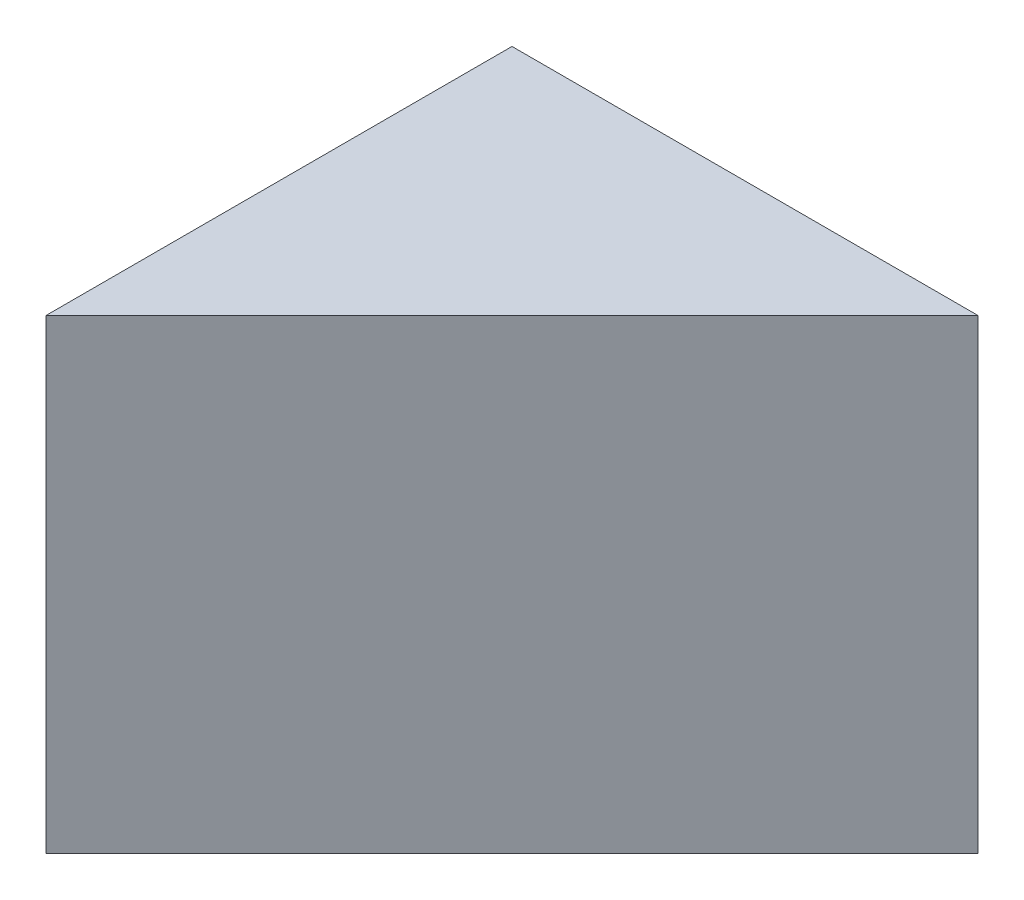
ISO-10303-21;
HEADER;
FILE_DESCRIPTION(('STEP AP214'),'2;1');
FILE_NAME('part.step','',(''),(''),'','','');
FILE_SCHEMA(('AUTOMOTIVE_DESIGN { 1 0 10303 214 1 1 1 1 }'));
ENDSEC;
DATA;
#1=APPLICATION_CONTEXT('core data for automotive mechanical design processes');
#2=APPLICATION_PROTOCOL_DEFINITION('international standard','automotive_design',2000,#1);
#3=PRODUCT_CONTEXT('',#1,'mechanical');
#4=PRODUCT('Part','Part','',(#3));
#5=PRODUCT_RELATED_PRODUCT_CATEGORY('part','',(#4));
#6=PRODUCT_DEFINITION_FORMATION('','',#4);
#7=PRODUCT_DEFINITION_CONTEXT('part definition',#1,'design');
#8=PRODUCT_DEFINITION('design','',#6,#7);
#9=PRODUCT_DEFINITION_SHAPE('','',#8);
#10=(LENGTH_UNIT() NAMED_UNIT(*) SI_UNIT(.MILLI.,.METRE.));
#11=(NAMED_UNIT(*) PLANE_ANGLE_UNIT() SI_UNIT($,.RADIAN.));
#12=(NAMED_UNIT(*) SI_UNIT($,.STERADIAN.) SOLID_ANGLE_UNIT());
#13=UNCERTAINTY_MEASURE_WITH_UNIT(LENGTH_MEASURE(1.E-05),#10,'distance_accuracy_value','');
#14=(GEOMETRIC_REPRESENTATION_CONTEXT(3) GLOBAL_UNCERTAINTY_ASSIGNED_CONTEXT((#13)) GLOBAL_UNIT_ASSIGNED_CONTEXT((#10,
#11,#12)) REPRESENTATION_CONTEXT('',''));
#15=CARTESIAN_POINT('',(0.,0.,0.));
#16=DIRECTION('',(0.,0.,1.));
#17=DIRECTION('',(1.,0.,0.));
#18=AXIS2_PLACEMENT_3D('',#15,#16,#17);
#19=CARTESIAN_POINT('',(-12.5,12.5,12.5));
#20=DIRECTION('',(1.,0.,0.));
#21=DIRECTION('',(0.,0.,-1.));
#22=AXIS2_PLACEMENT_3D('',#19,#20,#21);
#23=PLANE('',#22);
#24=DIRECTION('',(0.,0.,1.));
#25=VECTOR('',#24,1.);
#26=CARTESIAN_POINT('',(-12.5,-12.5,12.5));
#27=LINE('',#26,#25);
#28=CARTESIAN_POINT('',(-12.5,-12.5,-12.5));
#29=VERTEX_POINT('',#28);
#30=CARTESIAN_POINT('',(-12.5,-12.5,12.5));
#31=VERTEX_POINT('',#30);
#32=EDGE_CURVE('E80',#29,#31,#27,.T.);
#33=ORIENTED_EDGE('',*,*,#32,.T.);
#34=DIRECTION('',(0.,-1.,0.));
#35=VECTOR('',#34,1.);
#36=CARTESIAN_POINT('',(-12.5,12.5,12.5));
#37=LINE('',#36,#35);
#38=CARTESIAN_POINT('',(-12.5,12.5,12.5));
#39=VERTEX_POINT('',#38);
#40=EDGE_CURVE('E11',#39,#31,#37,.T.);
#41=ORIENTED_EDGE('',*,*,#40,.F.);
#42=DIRECTION('',(0.,0.,1.));
#43=VECTOR('',#42,1.);
#44=CARTESIAN_POINT('',(-12.5,12.5,12.5));
#45=LINE('',#44,#43);
#46=CARTESIAN_POINT('',(-12.5,12.5,-12.5));
#47=VERTEX_POINT('',#46);
#48=EDGE_CURVE('E73',#47,#39,#45,.T.);
#49=ORIENTED_EDGE('',*,*,#48,.F.);
#50=DIRECTION('',(0.,-1.,0.));
#51=VECTOR('',#50,1.);
#52=CARTESIAN_POINT('',(-12.5,12.5,-12.5));
#53=LINE('',#52,#51);
#54=EDGE_CURVE('E81',#47,#29,#53,.T.);
#55=ORIENTED_EDGE('',*,*,#54,.T.);
#56=EDGE_LOOP('',(#33,#41,#49,#55));
#57=FACE_BOUND('',#56,.T.);
#58=ADVANCED_FACE('F33',(#57),#23,.F.);
#59=CARTESIAN_POINT('',(12.5,12.5,-12.5));
#60=DIRECTION('',(-0.707106781186547,0.,-0.707106781186547));
#61=DIRECTION('',(-0.707106781186548,0.,0.707106781186548));
#62=AXIS2_PLACEMENT_3D('',#59,#60,#61);
#63=PLANE('',#62);
#64=DIRECTION('',(0.707106781186547,0.,-0.707106781186547));
#65=VECTOR('',#64,1.);
#66=CARTESIAN_POINT('',(12.5,-12.5,-12.5));
#67=LINE('',#66,#65);
#68=CARTESIAN_POINT('',(12.5,-12.5,-12.5));
#69=VERTEX_POINT('',#68);
#70=EDGE_CURVE('E61',#31,#69,#67,.T.);
#71=ORIENTED_EDGE('',*,*,#70,.T.);
#72=DIRECTION('',(0.,-1.,0.));
#73=VECTOR('',#72,1.);
#74=CARTESIAN_POINT('',(12.5,12.5,-12.5));
#75=LINE('',#74,#73);
#76=CARTESIAN_POINT('',(12.5,12.5,-12.5));
#77=VERTEX_POINT('',#76);
#78=EDGE_CURVE('E41',#77,#69,#75,.T.);
#79=ORIENTED_EDGE('',*,*,#78,.F.);
#80=DIRECTION('',(0.707106781186547,0.,-0.707106781186547));
#81=VECTOR('',#80,1.);
#82=CARTESIAN_POINT('',(12.5,12.5,-12.5));
#83=LINE('',#82,#81);
#84=EDGE_CURVE('E69',#39,#77,#83,.T.);
#85=ORIENTED_EDGE('',*,*,#84,.F.);
#86=ORIENTED_EDGE('',*,*,#40,.T.);
#87=EDGE_LOOP('',(#71,#79,#85,#86));
#88=FACE_BOUND('',#87,.T.);
#89=ADVANCED_FACE('F70',(#88),#63,.F.);
#90=CARTESIAN_POINT('',(12.5,12.5,-12.5));
#91=DIRECTION('',(0.,0.,1.));
#92=DIRECTION('',(1.,0.,0.));
#93=AXIS2_PLACEMENT_3D('',#90,#91,#92);
#94=PLANE('',#93);
#95=DIRECTION('',(-1.,0.,0.));
#96=VECTOR('',#95,1.);
#97=CARTESIAN_POINT('',(12.5,-12.5,-12.5));
#98=LINE('',#97,#96);
#99=EDGE_CURVE('E66',#69,#29,#98,.T.);
#100=ORIENTED_EDGE('',*,*,#99,.T.);
#101=ORIENTED_EDGE('',*,*,#54,.F.);
#102=DIRECTION('',(-1.,0.,0.));
#103=VECTOR('',#102,1.);
#104=CARTESIAN_POINT('',(12.5,12.5,-12.5));
#105=LINE('',#104,#103);
#106=EDGE_CURVE('E49',#77,#47,#105,.T.);
#107=ORIENTED_EDGE('',*,*,#106,.F.);
#108=ORIENTED_EDGE('',*,*,#78,.T.);
#109=EDGE_LOOP('',(#100,#101,#107,#108));
#110=FACE_BOUND('',#109,.T.);
#111=ADVANCED_FACE('F88',(#110),#94,.F.);
#112=CARTESIAN_POINT('',(0.,12.5,0.));
#113=DIRECTION('',(0.,1.,0.));
#114=DIRECTION('',(0.,0.,1.));
#115=AXIS2_PLACEMENT_3D('',#112,#113,#114);
#116=PLANE('',#115);
#117=ORIENTED_EDGE('',*,*,#48,.T.);
#118=ORIENTED_EDGE('',*,*,#84,.T.);
#119=ORIENTED_EDGE('',*,*,#106,.T.);
#120=EDGE_LOOP('',(#117,#118,#119));
#121=FACE_BOUND('',#120,.T.);
#122=ADVANCED_FACE('F76',(#121),#116,.T.);
#123=CARTESIAN_POINT('',(0.,-12.5,0.));
#124=DIRECTION('',(0.,1.,0.));
#125=DIRECTION('',(0.,0.,1.));
#126=AXIS2_PLACEMENT_3D('',#123,#124,#125);
#127=PLANE('',#126);
#128=ORIENTED_EDGE('',*,*,#32,.F.);
#129=ORIENTED_EDGE('',*,*,#99,.F.);
#130=ORIENTED_EDGE('',*,*,#70,.F.);
#131=EDGE_LOOP('',(#128,#129,#130));
#132=FACE_BOUND('',#131,.T.);
#133=ADVANCED_FACE('F89',(#132),#127,.F.);
#134=CLOSED_SHELL('',(#58,#89,#111,#122,#133));
#135=MANIFOLD_SOLID_BREP('B2',#134);
#136=ADVANCED_BREP_SHAPE_REPRESENTATION('',(#18,#135),#14);
#137=SHAPE_DEFINITION_REPRESENTATION(#9,#136);
ENDSEC;
END-ISO-10303-21;
